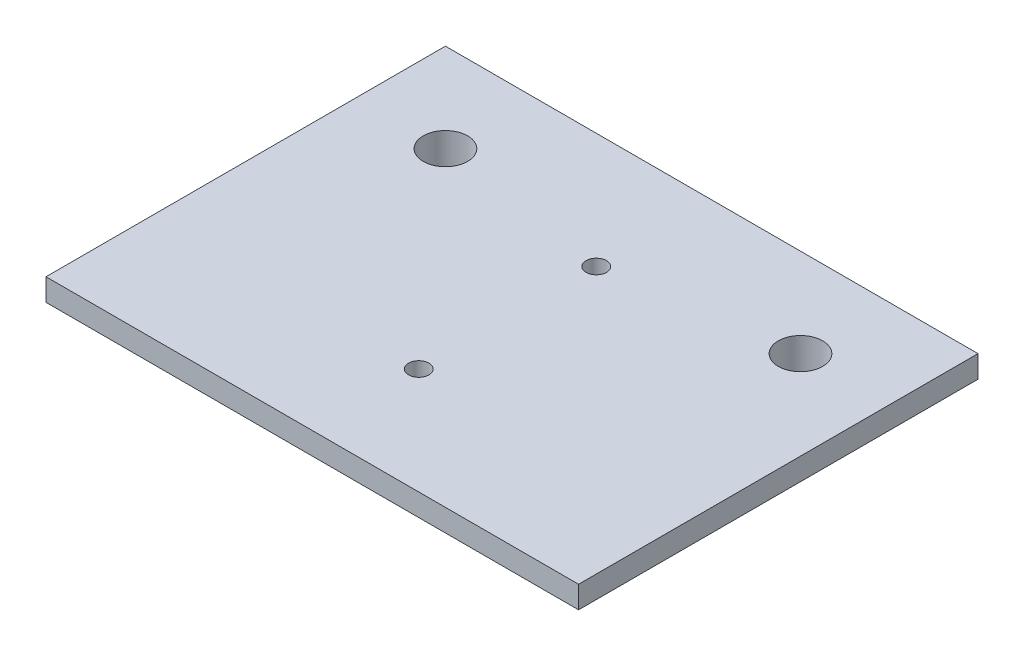
ISO-10303-21;
HEADER;
FILE_DESCRIPTION(('STEP AP214'),'2;1');
FILE_NAME('part.step','',(''),(''),'','','');
FILE_SCHEMA(('AUTOMOTIVE_DESIGN { 1 0 10303 214 1 1 1 1 }'));
ENDSEC;
DATA;
#1=APPLICATION_CONTEXT('core data for automotive mechanical design processes');
#2=APPLICATION_PROTOCOL_DEFINITION('international standard','automotive_design',2000,#1);
#3=PRODUCT_CONTEXT('',#1,'mechanical');
#4=PRODUCT('Part','Part','',(#3));
#5=PRODUCT_RELATED_PRODUCT_CATEGORY('part','',(#4));
#6=PRODUCT_DEFINITION_FORMATION('','',#4);
#7=PRODUCT_DEFINITION_CONTEXT('part definition',#1,'design');
#8=PRODUCT_DEFINITION('design','',#6,#7);
#9=PRODUCT_DEFINITION_SHAPE('','',#8);
#10=(LENGTH_UNIT() NAMED_UNIT(*) SI_UNIT(.MILLI.,.METRE.));
#11=(NAMED_UNIT(*) PLANE_ANGLE_UNIT() SI_UNIT($,.RADIAN.));
#12=(NAMED_UNIT(*) SI_UNIT($,.STERADIAN.) SOLID_ANGLE_UNIT());
#13=UNCERTAINTY_MEASURE_WITH_UNIT(LENGTH_MEASURE(1.E-05),#10,'distance_accuracy_value','');
#14=(GEOMETRIC_REPRESENTATION_CONTEXT(3) GLOBAL_UNCERTAINTY_ASSIGNED_CONTEXT((#13)) GLOBAL_UNIT_ASSIGNED_CONTEXT((#10,
#11,#12)) REPRESENTATION_CONTEXT('',''));
#15=CARTESIAN_POINT('',(0.,0.,0.));
#16=DIRECTION('',(0.,0.,1.));
#17=DIRECTION('',(1.,0.,0.));
#18=AXIS2_PLACEMENT_3D('',#15,#16,#17);
#19=CARTESIAN_POINT('',(0.,0.,0.));
#20=DIRECTION('',(0.,1.,0.));
#21=DIRECTION('',(0.,0.,1.));
#22=AXIS2_PLACEMENT_3D('',#19,#20,#21);
#23=PLANE('',#22);
#24=DIRECTION('',(0.,0.,1.));
#25=VECTOR('',#24,1.);
#26=CARTESIAN_POINT('',(-17.2427168179435,0.,6.35));
#27=LINE('',#26,#25);
#28=CARTESIAN_POINT('',(-17.2427168179435,0.,-6.35));
#29=VERTEX_POINT('',#28);
#30=CARTESIAN_POINT('',(-17.2427168179435,0.,6.35));
#31=VERTEX_POINT('',#30);
#32=EDGE_CURVE('E226',#29,#31,#27,.T.);
#33=ORIENTED_EDGE('',*,*,#32,.F.);
#34=DIRECTION('',(1.,0.,0.));
#35=VECTOR('',#34,1.);
#36=CARTESIAN_POINT('',(-29.9427168179435,0.,-6.35));
#37=LINE('',#36,#35);
#38=CARTESIAN_POINT('',(-29.9427168179435,0.,-6.35));
#39=VERTEX_POINT('',#38);
#40=EDGE_CURVE('E213',#39,#29,#37,.T.);
#41=ORIENTED_EDGE('',*,*,#40,.F.);
#42=DIRECTION('',(0.,0.,-1.));
#43=VECTOR('',#42,1.);
#44=CARTESIAN_POINT('',(-29.9427168179435,0.,6.35));
#45=LINE('',#44,#43);
#46=CARTESIAN_POINT('',(-29.9427168179435,0.,6.35));
#47=VERTEX_POINT('',#46);
#48=EDGE_CURVE('E217',#47,#39,#45,.T.);
#49=ORIENTED_EDGE('',*,*,#48,.F.);
#50=DIRECTION('',(-1.,0.,0.));
#51=VECTOR('',#50,1.);
#52=CARTESIAN_POINT('',(-29.9427168179435,0.,6.35));
#53=LINE('',#52,#51);
#54=EDGE_CURVE('E222',#31,#47,#53,.T.);
#55=ORIENTED_EDGE('',*,*,#54,.F.);
#56=EDGE_LOOP('',(#33,#41,#49,#55));
#57=FACE_BOUND('',#56,.T.);
#58=CARTESIAN_POINT('',(-48.9927168179435,0.,3.81000000000001));
#59=DIRECTION('',(0.,1.,0.));
#60=DIRECTION('',(0.,0.,1.));
#61=AXIS2_PLACEMENT_3D('',#58,#59,#60);
#62=CIRCLE('',#61,1.4605);
#63=CARTESIAN_POINT('',(-48.9927168179435,0.,5.27050000000001));
#64=VERTEX_POINT('',#63);
#65=EDGE_CURVE('E184',#64,#64,#62,.T.);
#66=ORIENTED_EDGE('',*,*,#65,.T.);
#67=EDGE_LOOP('',(#66));
#68=FACE_BOUND('',#67,.T.);
#69=DIRECTION('',(0.,0.,-1.));
#70=VECTOR('',#69,1.);
#71=CARTESIAN_POINT('',(-10.8927168179435,0.,-12.7));
#72=LINE('',#71,#70);
#73=CARTESIAN_POINT('',(-10.8927168179435,0.,44.45));
#74=VERTEX_POINT('',#73);
#75=CARTESIAN_POINT('',(-10.8927168179435,0.,-12.7));
#76=VERTEX_POINT('',#75);
#77=EDGE_CURVE('E309',#74,#76,#72,.T.);
#78=ORIENTED_EDGE('',*,*,#77,.F.);
#79=DIRECTION('',(1.,0.,0.));
#80=VECTOR('',#79,1.);
#81=CARTESIAN_POINT('',(-87.0927168179435,0.,44.45));
#82=LINE('',#81,#80);
#83=CARTESIAN_POINT('',(-87.0927168179435,0.,44.45));
#84=VERTEX_POINT('',#83);
#85=EDGE_CURVE('E315',#84,#74,#82,.T.);
#86=ORIENTED_EDGE('',*,*,#85,.F.);
#87=DIRECTION('',(0.,0.,1.));
#88=VECTOR('',#87,1.);
#89=CARTESIAN_POINT('',(-87.0927168179435,0.,-12.7));
#90=LINE('',#89,#88);
#91=CARTESIAN_POINT('',(-87.0927168179435,0.,-12.7));
#92=VERTEX_POINT('',#91);
#93=EDGE_CURVE('E331',#92,#84,#90,.T.);
#94=ORIENTED_EDGE('',*,*,#93,.F.);
#95=DIRECTION('',(-1.,0.,0.));
#96=VECTOR('',#95,1.);
#97=CARTESIAN_POINT('',(-87.0927168179435,0.,-12.7));
#98=LINE('',#97,#96);
#99=EDGE_CURVE('E328',#76,#92,#98,.T.);
#100=ORIENTED_EDGE('',*,*,#99,.F.);
#101=EDGE_LOOP('',(#78,#86,#94,#100));
#102=FACE_BOUND('',#101,.T.);
#103=DIRECTION('',(0.,0.,1.));
#104=VECTOR('',#103,1.);
#105=CARTESIAN_POINT('',(-42.6427168179435,0.,35.56));
#106=LINE('',#105,#104);
#107=CARTESIAN_POINT('',(-42.6427168179435,0.,22.86));
#108=VERTEX_POINT('',#107);
#109=CARTESIAN_POINT('',(-42.6427168179435,0.,35.56));
#110=VERTEX_POINT('',#109);
#111=EDGE_CURVE('E276',#108,#110,#106,.T.);
#112=ORIENTED_EDGE('',*,*,#111,.F.);
#113=DIRECTION('',(1.,0.,0.));
#114=VECTOR('',#113,1.);
#115=CARTESIAN_POINT('',(-55.3427168179435,0.,22.86));
#116=LINE('',#115,#114);
#117=CARTESIAN_POINT('',(-55.3427168179435,0.,22.86));
#118=VERTEX_POINT('',#117);
#119=EDGE_CURVE('E263',#118,#108,#116,.T.);
#120=ORIENTED_EDGE('',*,*,#119,.F.);
#121=DIRECTION('',(0.,0.,-1.));
#122=VECTOR('',#121,1.);
#123=CARTESIAN_POINT('',(-55.3427168179435,0.,35.56));
#124=LINE('',#123,#122);
#125=CARTESIAN_POINT('',(-55.3427168179435,0.,35.56));
#126=VERTEX_POINT('',#125);
#127=EDGE_CURVE('E267',#126,#118,#124,.T.);
#128=ORIENTED_EDGE('',*,*,#127,.F.);
#129=DIRECTION('',(-1.,0.,0.));
#130=VECTOR('',#129,1.);
#131=CARTESIAN_POINT('',(-55.3427168179435,0.,35.56));
#132=LINE('',#131,#130);
#133=EDGE_CURVE('E272',#110,#126,#132,.T.);
#134=ORIENTED_EDGE('',*,*,#133,.F.);
#135=EDGE_LOOP('',(#112,#120,#128,#134));
#136=FACE_BOUND('',#135,.T.);
#137=DIRECTION('',(0.,0.,1.));
#138=VECTOR('',#137,1.);
#139=CARTESIAN_POINT('',(-68.0427168179435,0.,6.35));
#140=LINE('',#139,#138);
#141=CARTESIAN_POINT('',(-68.0427168179435,0.,-6.35));
#142=VERTEX_POINT('',#141);
#143=CARTESIAN_POINT('',(-68.0427168179435,0.,6.35));
#144=VERTEX_POINT('',#143);
#145=EDGE_CURVE('E182',#142,#144,#140,.T.);
#146=ORIENTED_EDGE('',*,*,#145,.F.);
#147=DIRECTION('',(1.,0.,0.));
#148=VECTOR('',#147,1.);
#149=CARTESIAN_POINT('',(-80.7427168179435,0.,-6.35));
#150=LINE('',#149,#148);
#151=CARTESIAN_POINT('',(-80.7427168179435,0.,-6.35));
#152=VERTEX_POINT('',#151);
#153=EDGE_CURVE('E179',#152,#142,#150,.T.);
#154=ORIENTED_EDGE('',*,*,#153,.F.);
#155=DIRECTION('',(0.,0.,-1.));
#156=VECTOR('',#155,1.);
#157=CARTESIAN_POINT('',(-80.7427168179435,0.,6.35));
#158=LINE('',#157,#156);
#159=CARTESIAN_POINT('',(-80.7427168179435,0.,6.35));
#160=VERTEX_POINT('',#159);
#161=EDGE_CURVE('E66',#160,#152,#158,.T.);
#162=ORIENTED_EDGE('',*,*,#161,.F.);
#163=DIRECTION('',(-1.,0.,0.));
#164=VECTOR('',#163,1.);
#165=CARTESIAN_POINT('',(-80.7427168179435,0.,6.35));
#166=LINE('',#165,#164);
#167=EDGE_CURVE('E61',#144,#160,#166,.T.);
#168=ORIENTED_EDGE('',*,*,#167,.F.);
#169=EDGE_LOOP('',(#146,#154,#162,#168));
#170=FACE_BOUND('',#169,.T.);
#171=ADVANCED_FACE('F45',(#57,#68,#102,#136,#170),#23,.F.);
#172=CARTESIAN_POINT('',(0.,3.175,0.));
#173=DIRECTION('',(0.,1.,0.));
#174=DIRECTION('',(0.,0.,1.));
#175=AXIS2_PLACEMENT_3D('',#172,#173,#174);
#176=PLANE('',#175);
#177=CARTESIAN_POINT('',(-48.9927168179435,3.175,29.21));
#178=DIRECTION('',(0.,1.,0.));
#179=DIRECTION('',(0.,0.,1.));
#180=AXIS2_PLACEMENT_3D('',#177,#178,#179);
#181=CIRCLE('',#180,1.4605);
#182=CARTESIAN_POINT('',(-48.9927168179435,3.175,30.6705));
#183=VERTEX_POINT('',#182);
#184=EDGE_CURVE('E296',#183,#183,#181,.T.);
#185=ORIENTED_EDGE('',*,*,#184,.F.);
#186=EDGE_LOOP('',(#185));
#187=FACE_BOUND('',#186,.T.);
#188=CARTESIAN_POINT('',(-74.3927168179435,3.175,0.));
#189=DIRECTION('',(0.,1.,0.));
#190=DIRECTION('',(0.,0.,1.));
#191=AXIS2_PLACEMENT_3D('',#188,#189,#190);
#192=CIRCLE('',#191,3.175);
#193=CARTESIAN_POINT('',(-74.3927168179435,3.175,3.175));
#194=VERTEX_POINT('',#193);
#195=EDGE_CURVE('E305',#194,#194,#192,.T.);
#196=ORIENTED_EDGE('',*,*,#195,.F.);
#197=EDGE_LOOP('',(#196));
#198=FACE_BOUND('',#197,.T.);
#199=DIRECTION('',(0.,0.,-1.));
#200=VECTOR('',#199,1.);
#201=CARTESIAN_POINT('',(-10.8927168179435,3.175,-12.7));
#202=LINE('',#201,#200);
#203=CARTESIAN_POINT('',(-10.8927168179435,3.175,44.45));
#204=VERTEX_POINT('',#203);
#205=CARTESIAN_POINT('',(-10.8927168179435,3.175,-12.7));
#206=VERTEX_POINT('',#205);
#207=EDGE_CURVE('E310',#204,#206,#202,.T.);
#208=ORIENTED_EDGE('',*,*,#207,.T.);
#209=DIRECTION('',(-1.,0.,0.));
#210=VECTOR('',#209,1.);
#211=CARTESIAN_POINT('',(-87.0927168179435,3.175,-12.7));
#212=LINE('',#211,#210);
#213=CARTESIAN_POINT('',(-87.0927168179435,3.175,-12.7));
#214=VERTEX_POINT('',#213);
#215=EDGE_CURVE('E314',#206,#214,#212,.T.);
#216=ORIENTED_EDGE('',*,*,#215,.T.);
#217=DIRECTION('',(0.,0.,1.));
#218=VECTOR('',#217,1.);
#219=CARTESIAN_POINT('',(-87.0927168179435,3.175,-12.7));
#220=LINE('',#219,#218);
#221=CARTESIAN_POINT('',(-87.0927168179435,3.175,44.45));
#222=VERTEX_POINT('',#221);
#223=EDGE_CURVE('E318',#214,#222,#220,.T.);
#224=ORIENTED_EDGE('',*,*,#223,.T.);
#225=DIRECTION('',(1.,0.,0.));
#226=VECTOR('',#225,1.);
#227=CARTESIAN_POINT('',(-87.0927168179435,3.175,44.45));
#228=LINE('',#227,#226);
#229=EDGE_CURVE('E321',#222,#204,#228,.T.);
#230=ORIENTED_EDGE('',*,*,#229,.T.);
#231=EDGE_LOOP('',(#208,#216,#224,#230));
#232=FACE_BOUND('',#231,.T.);
#233=CARTESIAN_POINT('',(-23.5927168179435,3.175,0.));
#234=DIRECTION('',(0.,1.,0.));
#235=DIRECTION('',(0.,0.,1.));
#236=AXIS2_PLACEMENT_3D('',#233,#234,#235);
#237=CIRCLE('',#236,3.175);
#238=CARTESIAN_POINT('',(-23.5927168179435,3.175,3.175));
#239=VERTEX_POINT('',#238);
#240=EDGE_CURVE('E301',#239,#239,#237,.T.);
#241=ORIENTED_EDGE('',*,*,#240,.F.);
#242=EDGE_LOOP('',(#241));
#243=FACE_BOUND('',#242,.T.);
#244=CARTESIAN_POINT('',(-48.9927168179435,3.175,3.81000000000001));
#245=DIRECTION('',(0.,1.,0.));
#246=DIRECTION('',(0.,0.,1.));
#247=AXIS2_PLACEMENT_3D('',#244,#245,#246);
#248=CIRCLE('',#247,1.4605);
#249=CARTESIAN_POINT('',(-48.9927168179435,3.175,5.27050000000001));
#250=VERTEX_POINT('',#249);
#251=EDGE_CURVE('E189',#250,#250,#248,.T.);
#252=ORIENTED_EDGE('',*,*,#251,.F.);
#253=EDGE_LOOP('',(#252));
#254=FACE_BOUND('',#253,.T.);
#255=ADVANCED_FACE('F363',(#187,#198,#232,#243,#254),#176,.T.);
#256=CARTESIAN_POINT('',(-10.8927168179435,3.175,-12.7));
#257=DIRECTION('',(-1.,0.,0.));
#258=DIRECTION('',(0.,0.,1.));
#259=AXIS2_PLACEMENT_3D('',#256,#257,#258);
#260=PLANE('',#259);
#261=ORIENTED_EDGE('',*,*,#77,.T.);
#262=DIRECTION('',(0.,-1.,0.));
#263=VECTOR('',#262,1.);
#264=CARTESIAN_POINT('',(-10.8927168179435,3.175,-12.7));
#265=LINE('',#264,#263);
#266=EDGE_CURVE('E11',#206,#76,#265,.T.);
#267=ORIENTED_EDGE('',*,*,#266,.F.);
#268=ORIENTED_EDGE('',*,*,#207,.F.);
#269=DIRECTION('',(0.,-1.,0.));
#270=VECTOR('',#269,1.);
#271=CARTESIAN_POINT('',(-10.8927168179435,3.175,44.45));
#272=LINE('',#271,#270);
#273=EDGE_CURVE('E324',#204,#74,#272,.T.);
#274=ORIENTED_EDGE('',*,*,#273,.T.);
#275=EDGE_LOOP('',(#261,#267,#268,#274));
#276=FACE_BOUND('',#275,.T.);
#277=ADVANCED_FACE('F47',(#276),#260,.F.);
#278=CARTESIAN_POINT('',(-87.0927168179435,3.175,-12.7));
#279=DIRECTION('',(0.,0.,1.));
#280=DIRECTION('',(1.,0.,0.));
#281=AXIS2_PLACEMENT_3D('',#278,#279,#280);
#282=PLANE('',#281);
#283=ORIENTED_EDGE('',*,*,#99,.T.);
#284=DIRECTION('',(0.,-1.,0.));
#285=VECTOR('',#284,1.);
#286=CARTESIAN_POINT('',(-87.0927168179435,3.175,-12.7));
#287=LINE('',#286,#285);
#288=EDGE_CURVE('E54',#214,#92,#287,.T.);
#289=ORIENTED_EDGE('',*,*,#288,.F.);
#290=ORIENTED_EDGE('',*,*,#215,.F.);
#291=ORIENTED_EDGE('',*,*,#266,.T.);
#292=EDGE_LOOP('',(#283,#289,#290,#291));
#293=FACE_BOUND('',#292,.T.);
#294=ADVANCED_FACE('F365',(#293),#282,.F.);
#295=CARTESIAN_POINT('',(-87.0927168179435,3.175,-12.7));
#296=DIRECTION('',(1.,0.,0.));
#297=DIRECTION('',(0.,0.,-1.));
#298=AXIS2_PLACEMENT_3D('',#295,#296,#297);
#299=PLANE('',#298);
#300=ORIENTED_EDGE('',*,*,#93,.T.);
#301=DIRECTION('',(0.,-1.,0.));
#302=VECTOR('',#301,1.);
#303=CARTESIAN_POINT('',(-87.0927168179435,3.175,44.45));
#304=LINE('',#303,#302);
#305=EDGE_CURVE('E339',#222,#84,#304,.T.);
#306=ORIENTED_EDGE('',*,*,#305,.F.);
#307=ORIENTED_EDGE('',*,*,#223,.F.);
#308=ORIENTED_EDGE('',*,*,#288,.T.);
#309=EDGE_LOOP('',(#300,#306,#307,#308));
#310=FACE_BOUND('',#309,.T.);
#311=ADVANCED_FACE('F348',(#310),#299,.F.);
#312=CARTESIAN_POINT('',(-87.0927168179435,3.175,44.45));
#313=DIRECTION('',(0.,0.,-1.));
#314=DIRECTION('',(-1.,0.,0.));
#315=AXIS2_PLACEMENT_3D('',#312,#313,#314);
#316=PLANE('',#315);
#317=ORIENTED_EDGE('',*,*,#85,.T.);
#318=ORIENTED_EDGE('',*,*,#273,.F.);
#319=ORIENTED_EDGE('',*,*,#229,.F.);
#320=ORIENTED_EDGE('',*,*,#305,.T.);
#321=EDGE_LOOP('',(#317,#318,#319,#320));
#322=FACE_BOUND('',#321,.T.);
#323=ADVANCED_FACE('F357',(#322),#316,.F.);
#324=CARTESIAN_POINT('',(-74.3927168179435,3.175,0.));
#325=DIRECTION('',(0.,-1.,0.));
#326=DIRECTION('',(0.,0.,-1.));
#327=AXIS2_PLACEMENT_3D('',#324,#325,#326);
#328=CYLINDRICAL_SURFACE('',#327,3.175);
#329=ORIENTED_EDGE('',*,*,#195,.T.);
#330=EDGE_LOOP('',(#329));
#331=FACE_BOUND('',#330,.T.);
#332=CARTESIAN_POINT('',(-74.3927168179435,-3.175,0.));
#333=DIRECTION('',(0.,-1.,0.));
#334=DIRECTION('',(0.,0.,-1.));
#335=AXIS2_PLACEMENT_3D('',#332,#333,#334);
#336=CIRCLE('',#335,3.175);
#337=CARTESIAN_POINT('',(-74.3927168179435,-3.175,-3.17499999999999));
#338=VERTEX_POINT('',#337);
#339=EDGE_CURVE('E245',#338,#338,#336,.T.);
#340=ORIENTED_EDGE('',*,*,#339,.T.);
#341=EDGE_LOOP('',(#340));
#342=FACE_BOUND('',#341,.T.);
#343=ADVANCED_FACE('F386',(#331,#342),#328,.F.);
#344=CARTESIAN_POINT('',(-23.5927168179435,3.175,0.));
#345=DIRECTION('',(0.,-1.,0.));
#346=DIRECTION('',(0.,0.,-1.));
#347=AXIS2_PLACEMENT_3D('',#344,#345,#346);
#348=CYLINDRICAL_SURFACE('',#347,3.175);
#349=ORIENTED_EDGE('',*,*,#240,.T.);
#350=EDGE_LOOP('',(#349));
#351=FACE_BOUND('',#350,.T.);
#352=CARTESIAN_POINT('',(-23.5927168179435,-3.175,0.));
#353=DIRECTION('',(0.,-1.,0.));
#354=DIRECTION('',(0.,0.,-1.));
#355=AXIS2_PLACEMENT_3D('',#352,#353,#354);
#356=CIRCLE('',#355,3.175);
#357=CARTESIAN_POINT('',(-23.5927168179435,-3.175,-3.175));
#358=VERTEX_POINT('',#357);
#359=EDGE_CURVE('E230',#358,#358,#356,.T.);
#360=ORIENTED_EDGE('',*,*,#359,.T.);
#361=EDGE_LOOP('',(#360));
#362=FACE_BOUND('',#361,.T.);
#363=ADVANCED_FACE('F389',(#351,#362),#348,.F.);
#364=CARTESIAN_POINT('',(-48.9927168179435,3.175,29.21));
#365=DIRECTION('',(0.,-1.,0.));
#366=DIRECTION('',(0.,0.,-1.));
#367=AXIS2_PLACEMENT_3D('',#364,#365,#366);
#368=CYLINDRICAL_SURFACE('',#367,1.4605);
#369=ORIENTED_EDGE('',*,*,#184,.T.);
#370=EDGE_LOOP('',(#369));
#371=FACE_BOUND('',#370,.T.);
#372=CARTESIAN_POINT('',(-48.9927168179435,-3.175,29.21));
#373=DIRECTION('',(0.,-1.,0.));
#374=DIRECTION('',(0.,0.,-1.));
#375=AXIS2_PLACEMENT_3D('',#372,#373,#374);
#376=CIRCLE('',#375,1.4605);
#377=CARTESIAN_POINT('',(-48.9927168179435,-3.175,27.7495));
#378=VERTEX_POINT('',#377);
#379=EDGE_CURVE('E200',#378,#378,#376,.T.);
#380=ORIENTED_EDGE('',*,*,#379,.T.);
#381=EDGE_LOOP('',(#380));
#382=FACE_BOUND('',#381,.T.);
#383=ADVANCED_FACE('F394',(#371,#382),#368,.F.);
#384=CARTESIAN_POINT('',(-48.9927168179435,3.175,3.81000000000001));
#385=DIRECTION('',(0.,-1.,0.));
#386=DIRECTION('',(0.,0.,-1.));
#387=AXIS2_PLACEMENT_3D('',#384,#385,#386);
#388=CYLINDRICAL_SURFACE('',#387,1.4605);
#389=ORIENTED_EDGE('',*,*,#251,.T.);
#390=EDGE_LOOP('',(#389));
#391=FACE_BOUND('',#390,.T.);
#392=ORIENTED_EDGE('',*,*,#65,.F.);
#393=EDGE_LOOP('',(#392));
#394=FACE_BOUND('',#393,.T.);
#395=ADVANCED_FACE('F401',(#391,#394),#388,.F.);
#396=CARTESIAN_POINT('',(0.,-3.175,0.));
#397=DIRECTION('',(0.,-1.,0.));
#398=DIRECTION('',(0.,0.,-1.));
#399=AXIS2_PLACEMENT_3D('',#396,#397,#398);
#400=PLANE('',#399);
#401=DIRECTION('',(0.,0.,1.));
#402=VECTOR('',#401,1.);
#403=CARTESIAN_POINT('',(-42.6427168179435,-3.175,35.56));
#404=LINE('',#403,#402);
#405=CARTESIAN_POINT('',(-42.6427168179435,-3.175,22.86));
#406=VERTEX_POINT('',#405);
#407=CARTESIAN_POINT('',(-42.6427168179435,-3.175,35.56));
#408=VERTEX_POINT('',#407);
#409=EDGE_CURVE('E268',#406,#408,#404,.T.);
#410=ORIENTED_EDGE('',*,*,#409,.T.);
#411=DIRECTION('',(-1.,0.,0.));
#412=VECTOR('',#411,1.);
#413=CARTESIAN_POINT('',(-55.3427168179435,-3.175,35.56));
#414=LINE('',#413,#412);
#415=CARTESIAN_POINT('',(-55.3427168179435,-3.175,35.56));
#416=VERTEX_POINT('',#415);
#417=EDGE_CURVE('E285',#408,#416,#414,.T.);
#418=ORIENTED_EDGE('',*,*,#417,.T.);
#419=DIRECTION('',(0.,0.,-1.));
#420=VECTOR('',#419,1.);
#421=CARTESIAN_POINT('',(-55.3427168179435,-3.175,35.56));
#422=LINE('',#421,#420);
#423=CARTESIAN_POINT('',(-55.3427168179435,-3.175,22.86));
#424=VERTEX_POINT('',#423);
#425=EDGE_CURVE('E282',#416,#424,#422,.T.);
#426=ORIENTED_EDGE('',*,*,#425,.T.);
#427=DIRECTION('',(1.,0.,0.));
#428=VECTOR('',#427,1.);
#429=CARTESIAN_POINT('',(-55.3427168179435,-3.175,22.86));
#430=LINE('',#429,#428);
#431=EDGE_CURVE('E262',#424,#406,#430,.T.);
#432=ORIENTED_EDGE('',*,*,#431,.T.);
#433=EDGE_LOOP('',(#410,#418,#426,#432));
#434=FACE_BOUND('',#433,.T.);
#435=ORIENTED_EDGE('',*,*,#379,.F.);
#436=EDGE_LOOP('',(#435));
#437=FACE_BOUND('',#436,.T.);
#438=ADVANCED_FACE('F404',(#434,#437),#400,.T.);
#439=CARTESIAN_POINT('',(-42.6427168179435,-3.175,35.56));
#440=DIRECTION('',(-1.,0.,0.));
#441=DIRECTION('',(0.,0.,1.));
#442=AXIS2_PLACEMENT_3D('',#439,#440,#441);
#443=PLANE('',#442);
#444=ORIENTED_EDGE('',*,*,#111,.T.);
#445=DIRECTION('',(0.,1.,0.));
#446=VECTOR('',#445,1.);
#447=CARTESIAN_POINT('',(-42.6427168179435,-3.175,35.56));
#448=LINE('',#447,#446);
#449=EDGE_CURVE('E246',#408,#110,#448,.T.);
#450=ORIENTED_EDGE('',*,*,#449,.F.);
#451=ORIENTED_EDGE('',*,*,#409,.F.);
#452=DIRECTION('',(0.,1.,0.));
#453=VECTOR('',#452,1.);
#454=CARTESIAN_POINT('',(-42.6427168179435,-3.175,22.86));
#455=LINE('',#454,#453);
#456=EDGE_CURVE('E258',#406,#108,#455,.T.);
#457=ORIENTED_EDGE('',*,*,#456,.T.);
#458=EDGE_LOOP('',(#444,#450,#451,#457));
#459=FACE_BOUND('',#458,.T.);
#460=ADVANCED_FACE('F408',(#459),#443,.F.);
#461=CARTESIAN_POINT('',(-55.3427168179435,-3.175,35.56));
#462=DIRECTION('',(0.,0.,-1.));
#463=DIRECTION('',(-1.,0.,0.));
#464=AXIS2_PLACEMENT_3D('',#461,#462,#463);
#465=PLANE('',#464);
#466=ORIENTED_EDGE('',*,*,#133,.T.);
#467=DIRECTION('',(0.,1.,0.));
#468=VECTOR('',#467,1.);
#469=CARTESIAN_POINT('',(-55.3427168179435,-3.175,35.56));
#470=LINE('',#469,#468);
#471=EDGE_CURVE('E250',#416,#126,#470,.T.);
#472=ORIENTED_EDGE('',*,*,#471,.F.);
#473=ORIENTED_EDGE('',*,*,#417,.F.);
#474=ORIENTED_EDGE('',*,*,#449,.T.);
#475=EDGE_LOOP('',(#466,#472,#473,#474));
#476=FACE_BOUND('',#475,.T.);
#477=ADVANCED_FACE('F418',(#476),#465,.F.);
#478=CARTESIAN_POINT('',(-55.3427168179435,-3.175,35.56));
#479=DIRECTION('',(1.,0.,0.));
#480=DIRECTION('',(0.,0.,-1.));
#481=AXIS2_PLACEMENT_3D('',#478,#479,#480);
#482=PLANE('',#481);
#483=ORIENTED_EDGE('',*,*,#127,.T.);
#484=DIRECTION('',(0.,1.,0.));
#485=VECTOR('',#484,1.);
#486=CARTESIAN_POINT('',(-55.3427168179435,-3.175,22.86));
#487=LINE('',#486,#485);
#488=EDGE_CURVE('E254',#424,#118,#487,.T.);
#489=ORIENTED_EDGE('',*,*,#488,.F.);
#490=ORIENTED_EDGE('',*,*,#425,.F.);
#491=ORIENTED_EDGE('',*,*,#471,.T.);
#492=EDGE_LOOP('',(#483,#489,#490,#491));
#493=FACE_BOUND('',#492,.T.);
#494=ADVANCED_FACE('F414',(#493),#482,.F.);
#495=CARTESIAN_POINT('',(-55.3427168179435,-3.175,22.86));
#496=DIRECTION('',(0.,0.,1.));
#497=DIRECTION('',(1.,0.,0.));
#498=AXIS2_PLACEMENT_3D('',#495,#496,#497);
#499=PLANE('',#498);
#500=ORIENTED_EDGE('',*,*,#119,.T.);
#501=ORIENTED_EDGE('',*,*,#456,.F.);
#502=ORIENTED_EDGE('',*,*,#431,.F.);
#503=ORIENTED_EDGE('',*,*,#488,.T.);
#504=EDGE_LOOP('',(#500,#501,#502,#503));
#505=FACE_BOUND('',#504,.T.);
#506=ADVANCED_FACE('F410',(#505),#499,.F.);
#507=CARTESIAN_POINT('',(0.,-3.175,0.));
#508=DIRECTION('',(0.,-1.,0.));
#509=DIRECTION('',(0.,0.,-1.));
#510=AXIS2_PLACEMENT_3D('',#507,#508,#509);
#511=PLANE('',#510);
#512=DIRECTION('',(0.,0.,1.));
#513=VECTOR('',#512,1.);
#514=CARTESIAN_POINT('',(-17.2427168179435,-3.175,6.35));
#515=LINE('',#514,#513);
#516=CARTESIAN_POINT('',(-17.2427168179435,-3.175,-6.35));
#517=VERTEX_POINT('',#516);
#518=CARTESIAN_POINT('',(-17.2427168179435,-3.175,6.35));
#519=VERTEX_POINT('',#518);
#520=EDGE_CURVE('E218',#517,#519,#515,.T.);
#521=ORIENTED_EDGE('',*,*,#520,.T.);
#522=DIRECTION('',(-1.,0.,0.));
#523=VECTOR('',#522,1.);
#524=CARTESIAN_POINT('',(-29.9427168179435,-3.175,6.35));
#525=LINE('',#524,#523);
#526=CARTESIAN_POINT('',(-29.9427168179435,-3.175,6.35));
#527=VERTEX_POINT('',#526);
#528=EDGE_CURVE('E236',#519,#527,#525,.T.);
#529=ORIENTED_EDGE('',*,*,#528,.T.);
#530=DIRECTION('',(0.,0.,-1.));
#531=VECTOR('',#530,1.);
#532=CARTESIAN_POINT('',(-29.9427168179435,-3.175,6.35));
#533=LINE('',#532,#531);
#534=CARTESIAN_POINT('',(-29.9427168179435,-3.175,-6.35));
#535=VERTEX_POINT('',#534);
#536=EDGE_CURVE('E233',#527,#535,#533,.T.);
#537=ORIENTED_EDGE('',*,*,#536,.T.);
#538=DIRECTION('',(1.,0.,0.));
#539=VECTOR('',#538,1.);
#540=CARTESIAN_POINT('',(-29.9427168179435,-3.175,-6.35));
#541=LINE('',#540,#539);
#542=EDGE_CURVE('E212',#535,#517,#541,.T.);
#543=ORIENTED_EDGE('',*,*,#542,.T.);
#544=EDGE_LOOP('',(#521,#529,#537,#543));
#545=FACE_BOUND('',#544,.T.);
#546=ORIENTED_EDGE('',*,*,#359,.F.);
#547=EDGE_LOOP('',(#546));
#548=FACE_BOUND('',#547,.T.);
#549=ADVANCED_FACE('F413',(#545,#548),#511,.T.);
#550=CARTESIAN_POINT('',(-17.2427168179435,-3.175,6.35));
#551=DIRECTION('',(-1.,0.,0.));
#552=DIRECTION('',(0.,0.,1.));
#553=AXIS2_PLACEMENT_3D('',#550,#551,#552);
#554=PLANE('',#553);
#555=ORIENTED_EDGE('',*,*,#32,.T.);
#556=DIRECTION('',(0.,1.,0.));
#557=VECTOR('',#556,1.);
#558=CARTESIAN_POINT('',(-17.2427168179435,-3.175,6.35));
#559=LINE('',#558,#557);
#560=EDGE_CURVE('E195',#519,#31,#559,.T.);
#561=ORIENTED_EDGE('',*,*,#560,.F.);
#562=ORIENTED_EDGE('',*,*,#520,.F.);
#563=DIRECTION('',(0.,1.,0.));
#564=VECTOR('',#563,1.);
#565=CARTESIAN_POINT('',(-17.2427168179435,-3.175,-6.35));
#566=LINE('',#565,#564);
#567=EDGE_CURVE('E208',#517,#29,#566,.T.);
#568=ORIENTED_EDGE('',*,*,#567,.T.);
#569=EDGE_LOOP('',(#555,#561,#562,#568));
#570=FACE_BOUND('',#569,.T.);
#571=ADVANCED_FACE('F428',(#570),#554,.F.);
#572=CARTESIAN_POINT('',(-29.9427168179435,-3.175,6.35));
#573=DIRECTION('',(0.,0.,-1.));
#574=DIRECTION('',(-1.,0.,0.));
#575=AXIS2_PLACEMENT_3D('',#572,#573,#574);
#576=PLANE('',#575);
#577=ORIENTED_EDGE('',*,*,#54,.T.);
#578=DIRECTION('',(0.,1.,0.));
#579=VECTOR('',#578,1.);
#580=CARTESIAN_POINT('',(-29.9427168179435,-3.175,6.35));
#581=LINE('',#580,#579);
#582=EDGE_CURVE('E199',#527,#47,#581,.T.);
#583=ORIENTED_EDGE('',*,*,#582,.F.);
#584=ORIENTED_EDGE('',*,*,#528,.F.);
#585=ORIENTED_EDGE('',*,*,#560,.T.);
#586=EDGE_LOOP('',(#577,#583,#584,#585));
#587=FACE_BOUND('',#586,.T.);
#588=ADVANCED_FACE('F437',(#587),#576,.F.);
#589=CARTESIAN_POINT('',(-29.9427168179435,-3.175,6.35));
#590=DIRECTION('',(1.,0.,0.));
#591=DIRECTION('',(0.,0.,-1.));
#592=AXIS2_PLACEMENT_3D('',#589,#590,#591);
#593=PLANE('',#592);
#594=ORIENTED_EDGE('',*,*,#48,.T.);
#595=DIRECTION('',(0.,1.,0.));
#596=VECTOR('',#595,1.);
#597=CARTESIAN_POINT('',(-29.9427168179435,-3.175,-6.35));
#598=LINE('',#597,#596);
#599=EDGE_CURVE('E204',#535,#39,#598,.T.);
#600=ORIENTED_EDGE('',*,*,#599,.F.);
#601=ORIENTED_EDGE('',*,*,#536,.F.);
#602=ORIENTED_EDGE('',*,*,#582,.T.);
#603=EDGE_LOOP('',(#594,#600,#601,#602));
#604=FACE_BOUND('',#603,.T.);
#605=ADVANCED_FACE('F433',(#604),#593,.F.);
#606=CARTESIAN_POINT('',(-29.9427168179435,-3.175,-6.35));
#607=DIRECTION('',(0.,0.,1.));
#608=DIRECTION('',(1.,0.,0.));
#609=AXIS2_PLACEMENT_3D('',#606,#607,#608);
#610=PLANE('',#609);
#611=ORIENTED_EDGE('',*,*,#40,.T.);
#612=ORIENTED_EDGE('',*,*,#567,.F.);
#613=ORIENTED_EDGE('',*,*,#542,.F.);
#614=ORIENTED_EDGE('',*,*,#599,.T.);
#615=EDGE_LOOP('',(#611,#612,#613,#614));
#616=FACE_BOUND('',#615,.T.);
#617=ADVANCED_FACE('F430',(#616),#610,.F.);
#618=CARTESIAN_POINT('',(0.,-3.175,0.));
#619=DIRECTION('',(0.,-1.,0.));
#620=DIRECTION('',(0.,0.,-1.));
#621=AXIS2_PLACEMENT_3D('',#618,#619,#620);
#622=PLANE('',#621);
#623=DIRECTION('',(0.,0.,1.));
#624=VECTOR('',#623,1.);
#625=CARTESIAN_POINT('',(-68.0427168179435,-3.175,6.35));
#626=LINE('',#625,#624);
#627=CARTESIAN_POINT('',(-68.0427168179435,-3.175,-6.35));
#628=VERTEX_POINT('',#627);
#629=CARTESIAN_POINT('',(-68.0427168179435,-3.175,6.35));
#630=VERTEX_POINT('',#629);
#631=EDGE_CURVE('E168',#628,#630,#626,.T.);
#632=ORIENTED_EDGE('',*,*,#631,.T.);
#633=DIRECTION('',(-1.,0.,0.));
#634=VECTOR('',#633,1.);
#635=CARTESIAN_POINT('',(-80.7427168179435,-3.175,6.35));
#636=LINE('',#635,#634);
#637=CARTESIAN_POINT('',(-80.7427168179435,-3.175,6.35));
#638=VERTEX_POINT('',#637);
#639=EDGE_CURVE('E156',#630,#638,#636,.T.);
#640=ORIENTED_EDGE('',*,*,#639,.T.);
#641=DIRECTION('',(0.,0.,-1.));
#642=VECTOR('',#641,1.);
#643=CARTESIAN_POINT('',(-80.7427168179435,-3.175,6.35));
#644=LINE('',#643,#642);
#645=CARTESIAN_POINT('',(-80.7427168179435,-3.175,-6.35));
#646=VERTEX_POINT('',#645);
#647=EDGE_CURVE('E167',#638,#646,#644,.T.);
#648=ORIENTED_EDGE('',*,*,#647,.T.);
#649=DIRECTION('',(1.,0.,0.));
#650=VECTOR('',#649,1.);
#651=CARTESIAN_POINT('',(-80.7427168179435,-3.175,-6.35));
#652=LINE('',#651,#650);
#653=EDGE_CURVE('E174',#646,#628,#652,.T.);
#654=ORIENTED_EDGE('',*,*,#653,.T.);
#655=EDGE_LOOP('',(#632,#640,#648,#654));
#656=FACE_BOUND('',#655,.T.);
#657=ORIENTED_EDGE('',*,*,#339,.F.);
#658=EDGE_LOOP('',(#657));
#659=FACE_BOUND('',#658,.T.);
#660=ADVANCED_FACE('F171',(#656,#659),#622,.T.);
#661=CARTESIAN_POINT('',(-68.0427168179435,-3.175,6.35));
#662=DIRECTION('',(-1.,0.,0.));
#663=DIRECTION('',(0.,0.,1.));
#664=AXIS2_PLACEMENT_3D('',#661,#662,#663);
#665=PLANE('',#664);
#666=ORIENTED_EDGE('',*,*,#145,.T.);
#667=DIRECTION('',(0.,1.,0.));
#668=VECTOR('',#667,1.);
#669=CARTESIAN_POINT('',(-68.0427168179435,-3.175,6.35));
#670=LINE('',#669,#668);
#671=EDGE_CURVE('E160',#630,#144,#670,.T.);
#672=ORIENTED_EDGE('',*,*,#671,.F.);
#673=ORIENTED_EDGE('',*,*,#631,.F.);
#674=DIRECTION('',(0.,1.,0.));
#675=VECTOR('',#674,1.);
#676=CARTESIAN_POINT('',(-68.0427168179435,-3.175,-6.35));
#677=LINE('',#676,#675);
#678=EDGE_CURVE('E611',#628,#142,#677,.T.);
#679=ORIENTED_EDGE('',*,*,#678,.T.);
#680=EDGE_LOOP('',(#666,#672,#673,#679));
#681=FACE_BOUND('',#680,.T.);
#682=ADVANCED_FACE('F181',(#681),#665,.F.);
#683=CARTESIAN_POINT('',(-80.7427168179435,-3.175,6.35));
#684=DIRECTION('',(0.,0.,-1.));
#685=DIRECTION('',(-1.,0.,0.));
#686=AXIS2_PLACEMENT_3D('',#683,#684,#685);
#687=PLANE('',#686);
#688=ORIENTED_EDGE('',*,*,#167,.T.);
#689=DIRECTION('',(0.,1.,0.));
#690=VECTOR('',#689,1.);
#691=CARTESIAN_POINT('',(-80.7427168179435,-3.175,6.35));
#692=LINE('',#691,#690);
#693=EDGE_CURVE('E163',#638,#160,#692,.T.);
#694=ORIENTED_EDGE('',*,*,#693,.F.);
#695=ORIENTED_EDGE('',*,*,#639,.F.);
#696=ORIENTED_EDGE('',*,*,#671,.T.);
#697=EDGE_LOOP('',(#688,#694,#695,#696));
#698=FACE_BOUND('',#697,.T.);
#699=ADVANCED_FACE('F158',(#698),#687,.F.);
#700=CARTESIAN_POINT('',(-80.7427168179435,-3.175,6.35));
#701=DIRECTION('',(1.,0.,0.));
#702=DIRECTION('',(0.,0.,-1.));
#703=AXIS2_PLACEMENT_3D('',#700,#701,#702);
#704=PLANE('',#703);
#705=ORIENTED_EDGE('',*,*,#161,.T.);
#706=DIRECTION('',(0.,1.,0.));
#707=VECTOR('',#706,1.);
#708=CARTESIAN_POINT('',(-80.7427168179435,-3.175,-6.35));
#709=LINE('',#708,#707);
#710=EDGE_CURVE('E191',#646,#152,#709,.T.);
#711=ORIENTED_EDGE('',*,*,#710,.F.);
#712=ORIENTED_EDGE('',*,*,#647,.F.);
#713=ORIENTED_EDGE('',*,*,#693,.T.);
#714=EDGE_LOOP('',(#705,#711,#712,#713));
#715=FACE_BOUND('',#714,.T.);
#716=ADVANCED_FACE('F449',(#715),#704,.F.);
#717=CARTESIAN_POINT('',(-80.7427168179435,-3.175,-6.35));
#718=DIRECTION('',(0.,0.,1.));
#719=DIRECTION('',(1.,0.,0.));
#720=AXIS2_PLACEMENT_3D('',#717,#718,#719);
#721=PLANE('',#720);
#722=ORIENTED_EDGE('',*,*,#153,.T.);
#723=ORIENTED_EDGE('',*,*,#678,.F.);
#724=ORIENTED_EDGE('',*,*,#653,.F.);
#725=ORIENTED_EDGE('',*,*,#710,.T.);
#726=EDGE_LOOP('',(#722,#723,#724,#725));
#727=FACE_BOUND('',#726,.T.);
#728=ADVANCED_FACE('F452',(#727),#721,.F.);
#729=CLOSED_SHELL('',(#171,#255,#277,#294,#311,#323,#343,#363,#383,#395,#438,#460,#477,#494,
#506,#549,#571,#588,#605,#617,#660,#682,#699,#716,#728));
#730=MANIFOLD_SOLID_BREP('B2',#729);
#731=ADVANCED_BREP_SHAPE_REPRESENTATION('',(#18,#730),#14);
#732=SHAPE_DEFINITION_REPRESENTATION(#9,#731);
ENDSEC;
END-ISO-10303-21;
